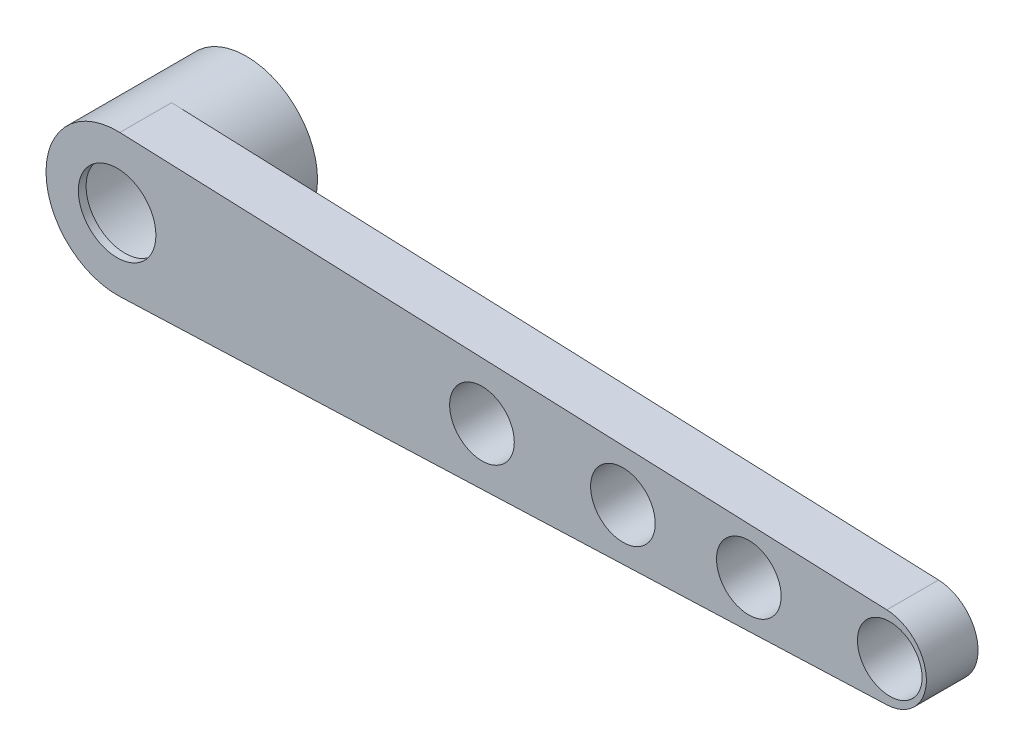
ISO-10303-21;
HEADER;
FILE_DESCRIPTION(('STEP AP214'),'2;1');
FILE_NAME('part.step','',(''),(''),'','','');
FILE_SCHEMA(('AUTOMOTIVE_DESIGN { 1 0 10303 214 1 1 1 1 }'));
ENDSEC;
DATA;
#1=APPLICATION_CONTEXT('core data for automotive mechanical design processes');
#2=APPLICATION_PROTOCOL_DEFINITION('international standard','automotive_design',2000,#1);
#3=PRODUCT_CONTEXT('',#1,'mechanical');
#4=PRODUCT('Part','Part','',(#3));
#5=PRODUCT_RELATED_PRODUCT_CATEGORY('part','',(#4));
#6=PRODUCT_DEFINITION_FORMATION('','',#4);
#7=PRODUCT_DEFINITION_CONTEXT('part definition',#1,'design');
#8=PRODUCT_DEFINITION('design','',#6,#7);
#9=PRODUCT_DEFINITION_SHAPE('','',#8);
#10=(LENGTH_UNIT() NAMED_UNIT(*) SI_UNIT(.MILLI.,.METRE.));
#11=(NAMED_UNIT(*) PLANE_ANGLE_UNIT() SI_UNIT($,.RADIAN.));
#12=(NAMED_UNIT(*) SI_UNIT($,.STERADIAN.) SOLID_ANGLE_UNIT());
#13=UNCERTAINTY_MEASURE_WITH_UNIT(LENGTH_MEASURE(1.E-05),#10,'distance_accuracy_value','');
#14=(GEOMETRIC_REPRESENTATION_CONTEXT(3) GLOBAL_UNCERTAINTY_ASSIGNED_CONTEXT((#13)) GLOBAL_UNIT_ASSIGNED_CONTEXT((#10,
#11,#12)) REPRESENTATION_CONTEXT('',''));
#15=CARTESIAN_POINT('',(0.,0.,0.));
#16=DIRECTION('',(0.,0.,1.));
#17=DIRECTION('',(1.,0.,0.));
#18=AXIS2_PLACEMENT_3D('',#15,#16,#17);
#19=CARTESIAN_POINT('',(0.,0.,5.));
#20=DIRECTION('',(0.,0.,-1.));
#21=DIRECTION('',(-1.,0.,0.));
#22=AXIS2_PLACEMENT_3D('',#19,#20,#21);
#23=CYLINDRICAL_SURFACE('',#22,2.75);
#24=CARTESIAN_POINT('',(0.,0.,0.));
#25=DIRECTION('',(0.,0.,1.));
#26=DIRECTION('',(1.,0.,0.));
#27=AXIS2_PLACEMENT_3D('',#24,#25,#26);
#28=CIRCLE('',#27,2.75);
#29=CARTESIAN_POINT('',(2.75,0.,0.));
#30=VERTEX_POINT('',#29);
#31=EDGE_CURVE('E44',#30,#30,#28,.T.);
#32=ORIENTED_EDGE('',*,*,#31,.T.);
#33=EDGE_LOOP('',(#32));
#34=FACE_BOUND('',#33,.T.);
#35=DIRECTION('',(0.,0.,1.));
#36=VECTOR('',#35,1.);
#37=CARTESIAN_POINT('',(0.107193479801559,-2.74791003453316,3.));
#38=LINE('',#37,#36);
#39=CARTESIAN_POINT('',(0.107193479801559,-2.74791003453316,3.));
#40=VERTEX_POINT('',#39);
#41=CARTESIAN_POINT('',(0.107193479801559,-2.74791003453316,5.));
#42=VERTEX_POINT('',#41);
#43=EDGE_CURVE('E98',#40,#42,#38,.T.);
#44=ORIENTED_EDGE('',*,*,#43,.T.);
#45=CARTESIAN_POINT('',(0.,0.,5.));
#46=DIRECTION('',(0.,0.,1.));
#47=DIRECTION('',(1.,0.,0.));
#48=AXIS2_PLACEMENT_3D('',#45,#46,#47);
#49=CIRCLE('',#48,2.75);
#50=CARTESIAN_POINT('',(0.107193479801559,2.74791003453316,5.));
#51=VERTEX_POINT('',#50);
#52=EDGE_CURVE('E11',#51,#42,#49,.T.);
#53=ORIENTED_EDGE('',*,*,#52,.F.);
#54=DIRECTION('',(0.,0.,1.));
#55=VECTOR('',#54,1.);
#56=CARTESIAN_POINT('',(0.107193479801559,2.74791003453316,3.));
#57=LINE('',#56,#55);
#58=CARTESIAN_POINT('',(0.107193479801559,2.74791003453316,3.));
#59=VERTEX_POINT('',#58);
#60=EDGE_CURVE('E93',#59,#51,#57,.T.);
#61=ORIENTED_EDGE('',*,*,#60,.F.);
#62=CARTESIAN_POINT('',(0.,0.,3.));
#63=DIRECTION('',(0.,0.,1.));
#64=DIRECTION('',(1.,0.,0.));
#65=AXIS2_PLACEMENT_3D('',#62,#63,#64);
#66=CIRCLE('',#65,2.75);
#67=EDGE_CURVE('E84',#40,#59,#66,.T.);
#68=ORIENTED_EDGE('',*,*,#67,.F.);
#69=EDGE_LOOP('',(#44,#53,#61,#68));
#70=FACE_BOUND('',#69,.T.);
#71=ADVANCED_FACE('F36',(#34,#70),#23,.T.);
#72=CARTESIAN_POINT('',(0.,0.,5.));
#73=DIRECTION('',(0.,0.,1.));
#74=DIRECTION('',(1.,0.,0.));
#75=AXIS2_PLACEMENT_3D('',#72,#73,#74);
#76=PLANE('',#75);
#77=CARTESIAN_POINT('',(19.56,0.,5.));
#78=DIRECTION('',(0.,0.,1.));
#79=DIRECTION('',(1.,0.,0.));
#80=AXIS2_PLACEMENT_3D('',#77,#78,#79);
#81=CIRCLE('',#80,1.25);
#82=CARTESIAN_POINT('',(20.81,0.,5.));
#83=VERTEX_POINT('',#82);
#84=EDGE_CURVE('E183',#83,#83,#81,.T.);
#85=ORIENTED_EDGE('',*,*,#84,.F.);
#86=EDGE_LOOP('',(#85));
#87=FACE_BOUND('',#86,.T.);
#88=CARTESIAN_POINT('',(0.,0.,5.));
#89=DIRECTION('',(0.,0.,1.));
#90=DIRECTION('',(1.,0.,0.));
#91=AXIS2_PLACEMENT_3D('',#88,#89,#90);
#92=CIRCLE('',#91,1.5);
#93=CARTESIAN_POINT('',(1.5,0.,5.));
#94=VERTEX_POINT('',#93);
#95=EDGE_CURVE('E104',#94,#94,#92,.T.);
#96=ORIENTED_EDGE('',*,*,#95,.F.);
#97=EDGE_LOOP('',(#96));
#98=FACE_BOUND('',#97,.T.);
#99=ORIENTED_EDGE('',*,*,#52,.T.);
#100=DIRECTION('',(0.999240012557513,0.038979447200567,0.));
#101=VECTOR('',#100,1.);
#102=CARTESIAN_POINT('',(0.107193479801559,-2.74791003453316,5.));
#103=LINE('',#102,#101);
#104=CARTESIAN_POINT('',(29.7651809847428,-1.59097882331688,5.));
#105=VERTEX_POINT('',#104);
#106=EDGE_CURVE('E196',#42,#105,#103,.T.);
#107=ORIENTED_EDGE('',*,*,#106,.T.);
#108=CARTESIAN_POINT('',(29.7031183428736,0.,5.));
#109=DIRECTION('',(0.,0.,1.));
#110=DIRECTION('',(1.,0.,0.));
#111=AXIS2_PLACEMENT_3D('',#108,#109,#110);
#112=CIRCLE('',#111,1.59218886686177);
#113=CARTESIAN_POINT('',(29.7651809847428,1.59097882331688,5.));
#114=VERTEX_POINT('',#113);
#115=EDGE_CURVE('E209',#114,#105,#112,.F.);
#116=ORIENTED_EDGE('',*,*,#115,.F.);
#117=DIRECTION('',(0.999240012557513,-0.038979447200567,0.));
#118=VECTOR('',#117,1.);
#119=CARTESIAN_POINT('',(0.107193479801559,2.74791003453316,5.));
#120=LINE('',#119,#118);
#121=EDGE_CURVE('E51',#51,#114,#120,.T.);
#122=ORIENTED_EDGE('',*,*,#121,.F.);
#123=EDGE_LOOP('',(#99,#107,#116,#122));
#124=FACE_BOUND('',#123,.T.);
#125=CARTESIAN_POINT('',(29.8799998001637,0.00345575100310028,5.));
#126=DIRECTION('',(0.,0.,1.));
#127=DIRECTION('',(1.,0.,0.));
#128=AXIS2_PLACEMENT_3D('',#125,#126,#127);
#129=CIRCLE('',#128,1.25);
#130=CARTESIAN_POINT('',(31.1299998001637,0.00345575100310028,5.));
#131=VERTEX_POINT('',#130);
#132=EDGE_CURVE('E186',#131,#131,#129,.T.);
#133=ORIENTED_EDGE('',*,*,#132,.F.);
#134=EDGE_LOOP('',(#133));
#135=FACE_BOUND('',#134,.T.);
#136=CARTESIAN_POINT('',(24.43,0.,5.));
#137=DIRECTION('',(0.,0.,1.));
#138=DIRECTION('',(1.,0.,0.));
#139=AXIS2_PLACEMENT_3D('',#136,#137,#138);
#140=CIRCLE('',#139,1.25);
#141=CARTESIAN_POINT('',(25.68,0.,5.));
#142=VERTEX_POINT('',#141);
#143=EDGE_CURVE('E188',#142,#142,#140,.T.);
#144=ORIENTED_EDGE('',*,*,#143,.F.);
#145=EDGE_LOOP('',(#144));
#146=FACE_BOUND('',#145,.T.);
#147=CARTESIAN_POINT('',(14.11,0.,5.));
#148=DIRECTION('',(0.,0.,1.));
#149=DIRECTION('',(1.,0.,0.));
#150=AXIS2_PLACEMENT_3D('',#147,#148,#149);
#151=CIRCLE('',#150,1.25);
#152=CARTESIAN_POINT('',(15.36,0.,5.));
#153=VERTEX_POINT('',#152);
#154=EDGE_CURVE('E206',#153,#153,#151,.T.);
#155=ORIENTED_EDGE('',*,*,#154,.F.);
#156=EDGE_LOOP('',(#155));
#157=FACE_BOUND('',#156,.T.);
#158=ADVANCED_FACE('F136',(#87,#98,#124,#135,#146,#157),#76,.T.);
#159=CARTESIAN_POINT('',(0.,0.,0.));
#160=DIRECTION('',(0.,0.,1.));
#161=DIRECTION('',(1.,0.,0.));
#162=AXIS2_PLACEMENT_3D('',#159,#160,#161);
#163=PLANE('',#162);
#164=CARTESIAN_POINT('',(0.,0.,0.));
#165=DIRECTION('',(0.,0.,-1.));
#166=DIRECTION('',(-1.,0.,0.));
#167=AXIS2_PLACEMENT_3D('',#164,#165,#166);
#168=CIRCLE('',#167,2.5);
#169=CARTESIAN_POINT('',(-2.5,0.,0.));
#170=VERTEX_POINT('',#169);
#171=EDGE_CURVE('E111',#170,#170,#168,.T.);
#172=ORIENTED_EDGE('',*,*,#171,.F.);
#173=EDGE_LOOP('',(#172));
#174=FACE_BOUND('',#173,.T.);
#175=ORIENTED_EDGE('',*,*,#31,.F.);
#176=EDGE_LOOP('',(#175));
#177=FACE_BOUND('',#176,.T.);
#178=ADVANCED_FACE('F130',(#174,#177),#163,.F.);
#179=CARTESIAN_POINT('',(0.,0.,4.7));
#180=DIRECTION('',(0.,0.,-1.));
#181=DIRECTION('',(-1.,0.,0.));
#182=AXIS2_PLACEMENT_3D('',#179,#180,#181);
#183=CYLINDRICAL_SURFACE('',#182,2.5);
#184=CARTESIAN_POINT('',(0.,0.,4.7));
#185=DIRECTION('',(0.,0.,-1.));
#186=DIRECTION('',(-1.,0.,0.));
#187=AXIS2_PLACEMENT_3D('',#184,#185,#186);
#188=CIRCLE('',#187,2.5);
#189=CARTESIAN_POINT('',(-2.5,0.,4.7));
#190=VERTEX_POINT('',#189);
#191=EDGE_CURVE('E108',#190,#190,#188,.T.);
#192=ORIENTED_EDGE('',*,*,#191,.F.);
#193=EDGE_LOOP('',(#192));
#194=FACE_BOUND('',#193,.T.);
#195=ORIENTED_EDGE('',*,*,#171,.T.);
#196=EDGE_LOOP('',(#195));
#197=FACE_BOUND('',#196,.T.);
#198=ADVANCED_FACE('F124',(#194,#197),#183,.F.);
#199=CARTESIAN_POINT('',(0.,0.,4.7));
#200=DIRECTION('',(0.,0.,-1.));
#201=DIRECTION('',(-1.,0.,0.));
#202=AXIS2_PLACEMENT_3D('',#199,#200,#201);
#203=PLANE('',#202);
#204=CARTESIAN_POINT('',(0.,0.,4.7));
#205=DIRECTION('',(0.,0.,-1.));
#206=DIRECTION('',(-1.,0.,0.));
#207=AXIS2_PLACEMENT_3D('',#204,#205,#206);
#208=CIRCLE('',#207,1.5);
#209=CARTESIAN_POINT('',(-1.5,0.,4.7));
#210=VERTEX_POINT('',#209);
#211=EDGE_CURVE('E107',#210,#210,#208,.T.);
#212=ORIENTED_EDGE('',*,*,#211,.F.);
#213=EDGE_LOOP('',(#212));
#214=FACE_BOUND('',#213,.T.);
#215=ORIENTED_EDGE('',*,*,#191,.T.);
#216=EDGE_LOOP('',(#215));
#217=FACE_BOUND('',#216,.T.);
#218=ADVANCED_FACE('F121',(#214,#217),#203,.T.);
#219=CARTESIAN_POINT('',(0.,0.,0.3));
#220=DIRECTION('',(0.,0.,1.));
#221=DIRECTION('',(1.,0.,0.));
#222=AXIS2_PLACEMENT_3D('',#219,#220,#221);
#223=CYLINDRICAL_SURFACE('',#222,1.5);
#224=ORIENTED_EDGE('',*,*,#211,.T.);
#225=EDGE_LOOP('',(#224));
#226=FACE_BOUND('',#225,.T.);
#227=ORIENTED_EDGE('',*,*,#95,.T.);
#228=EDGE_LOOP('',(#227));
#229=FACE_BOUND('',#228,.T.);
#230=ADVANCED_FACE('F118',(#226,#229),#223,.F.);
#231=CARTESIAN_POINT('',(29.7031183428736,0.,3.));
#232=DIRECTION('',(0.,0.,1.));
#233=DIRECTION('',(1.,0.,0.));
#234=AXIS2_PLACEMENT_3D('',#231,#232,#233);
#235=CYLINDRICAL_SURFACE('',#234,1.59218886686177);
#236=ORIENTED_EDGE('',*,*,#115,.T.);
#237=DIRECTION('',(0.,0.,1.));
#238=VECTOR('',#237,1.);
#239=CARTESIAN_POINT('',(29.7651809847428,-1.59097882331688,3.));
#240=LINE('',#239,#238);
#241=CARTESIAN_POINT('',(29.7651809847428,-1.59097882331688,3.));
#242=VERTEX_POINT('',#241);
#243=EDGE_CURVE('E76',#242,#105,#240,.T.);
#244=ORIENTED_EDGE('',*,*,#243,.F.);
#245=CARTESIAN_POINT('',(29.7031183428736,0.,3.));
#246=DIRECTION('',(0.,0.,1.));
#247=DIRECTION('',(1.,0.,0.));
#248=AXIS2_PLACEMENT_3D('',#245,#246,#247);
#249=CIRCLE('',#248,1.59218886686177);
#250=CARTESIAN_POINT('',(29.7651809847428,1.59097882331688,3.));
#251=VERTEX_POINT('',#250);
#252=EDGE_CURVE('E60',#251,#242,#249,.F.);
#253=ORIENTED_EDGE('',*,*,#252,.F.);
#254=DIRECTION('',(0.,0.,1.));
#255=VECTOR('',#254,1.);
#256=CARTESIAN_POINT('',(29.7651809847428,1.59097882331688,3.));
#257=LINE('',#256,#255);
#258=EDGE_CURVE('E96',#251,#114,#257,.T.);
#259=ORIENTED_EDGE('',*,*,#258,.T.);
#260=EDGE_LOOP('',(#236,#244,#253,#259));
#261=FACE_BOUND('',#260,.T.);
#262=ADVANCED_FACE('F152',(#261),#235,.T.);
#263=CARTESIAN_POINT('',(0.107193479801559,-2.74791003453316,3.));
#264=DIRECTION('',(0.038979447200567,-0.999240012557513,0.));
#265=DIRECTION('',(0.999240012557513,0.038979447200567,0.));
#266=AXIS2_PLACEMENT_3D('',#263,#264,#265);
#267=PLANE('',#266);
#268=ORIENTED_EDGE('',*,*,#106,.F.);
#269=ORIENTED_EDGE('',*,*,#43,.F.);
#270=DIRECTION('',(0.999240012557513,0.038979447200567,0.));
#271=VECTOR('',#270,1.);
#272=CARTESIAN_POINT('',(0.107193479801559,-2.74791003453316,3.));
#273=LINE('',#272,#271);
#274=EDGE_CURVE('E86',#40,#242,#273,.T.);
#275=ORIENTED_EDGE('',*,*,#274,.T.);
#276=ORIENTED_EDGE('',*,*,#243,.T.);
#277=EDGE_LOOP('',(#268,#269,#275,#276));
#278=FACE_BOUND('',#277,.T.);
#279=ADVANCED_FACE('F164',(#278),#267,.T.);
#280=CARTESIAN_POINT('',(14.11,0.,3.));
#281=DIRECTION('',(0.,0.,1.));
#282=DIRECTION('',(1.,0.,0.));
#283=AXIS2_PLACEMENT_3D('',#280,#281,#282);
#284=CYLINDRICAL_SURFACE('',#283,1.25);
#285=CARTESIAN_POINT('',(14.11,0.,3.));
#286=DIRECTION('',(0.,0.,1.));
#287=DIRECTION('',(1.,0.,0.));
#288=AXIS2_PLACEMENT_3D('',#285,#286,#287);
#289=CIRCLE('',#288,1.25);
#290=CARTESIAN_POINT('',(15.36,0.,3.));
#291=VERTEX_POINT('',#290);
#292=EDGE_CURVE('E199',#291,#291,#289,.T.);
#293=ORIENTED_EDGE('',*,*,#292,.F.);
#294=EDGE_LOOP('',(#293));
#295=FACE_BOUND('',#294,.T.);
#296=ORIENTED_EDGE('',*,*,#154,.T.);
#297=EDGE_LOOP('',(#296));
#298=FACE_BOUND('',#297,.T.);
#299=ADVANCED_FACE('F160',(#295,#298),#284,.F.);
#300=CARTESIAN_POINT('',(24.43,0.,3.));
#301=DIRECTION('',(0.,0.,1.));
#302=DIRECTION('',(1.,0.,0.));
#303=AXIS2_PLACEMENT_3D('',#300,#301,#302);
#304=CYLINDRICAL_SURFACE('',#303,1.25);
#305=CARTESIAN_POINT('',(24.43,0.,3.));
#306=DIRECTION('',(0.,0.,1.));
#307=DIRECTION('',(1.,0.,0.));
#308=AXIS2_PLACEMENT_3D('',#305,#306,#307);
#309=CIRCLE('',#308,1.25);
#310=CARTESIAN_POINT('',(25.68,0.,3.));
#311=VERTEX_POINT('',#310);
#312=EDGE_CURVE('E195',#311,#311,#309,.T.);
#313=ORIENTED_EDGE('',*,*,#312,.F.);
#314=EDGE_LOOP('',(#313));
#315=FACE_BOUND('',#314,.T.);
#316=ORIENTED_EDGE('',*,*,#143,.T.);
#317=EDGE_LOOP('',(#316));
#318=FACE_BOUND('',#317,.T.);
#319=ADVANCED_FACE('F156',(#315,#318),#304,.F.);
#320=CARTESIAN_POINT('',(29.8799998001637,0.00345575100310028,3.));
#321=DIRECTION('',(0.,0.,1.));
#322=DIRECTION('',(1.,0.,0.));
#323=AXIS2_PLACEMENT_3D('',#320,#321,#322);
#324=CYLINDRICAL_SURFACE('',#323,1.25);
#325=CARTESIAN_POINT('',(29.8799998001637,0.00345575100310028,3.));
#326=DIRECTION('',(0.,0.,1.));
#327=DIRECTION('',(1.,0.,0.));
#328=AXIS2_PLACEMENT_3D('',#325,#326,#327);
#329=CIRCLE('',#328,1.25);
#330=CARTESIAN_POINT('',(31.1299998001637,0.00345575100310028,3.));
#331=VERTEX_POINT('',#330);
#332=EDGE_CURVE('E192',#331,#331,#329,.T.);
#333=ORIENTED_EDGE('',*,*,#332,.F.);
#334=EDGE_LOOP('',(#333));
#335=FACE_BOUND('',#334,.T.);
#336=ORIENTED_EDGE('',*,*,#132,.T.);
#337=EDGE_LOOP('',(#336));
#338=FACE_BOUND('',#337,.T.);
#339=ADVANCED_FACE('F153',(#335,#338),#324,.F.);
#340=CARTESIAN_POINT('',(0.107193479801559,2.74791003453316,3.));
#341=DIRECTION('',(-0.038979447200567,-0.999240012557513,0.));
#342=DIRECTION('',(0.999240012557513,-0.038979447200567,0.));
#343=AXIS2_PLACEMENT_3D('',#340,#341,#342);
#344=PLANE('',#343);
#345=ORIENTED_EDGE('',*,*,#121,.T.);
#346=ORIENTED_EDGE('',*,*,#258,.F.);
#347=DIRECTION('',(0.999240012557513,-0.038979447200567,0.));
#348=VECTOR('',#347,1.);
#349=CARTESIAN_POINT('',(0.107193479801559,2.74791003453316,3.));
#350=LINE('',#349,#348);
#351=EDGE_CURVE('E81',#59,#251,#350,.T.);
#352=ORIENTED_EDGE('',*,*,#351,.F.);
#353=ORIENTED_EDGE('',*,*,#60,.T.);
#354=EDGE_LOOP('',(#345,#346,#352,#353));
#355=FACE_BOUND('',#354,.T.);
#356=ADVANCED_FACE('F92',(#355),#344,.F.);
#357=CARTESIAN_POINT('',(0.,0.,3.));
#358=DIRECTION('',(0.,0.,1.));
#359=DIRECTION('',(1.,0.,0.));
#360=AXIS2_PLACEMENT_3D('',#357,#358,#359);
#361=PLANE('',#360);
#362=CARTESIAN_POINT('',(19.56,0.,3.));
#363=DIRECTION('',(0.,0.,1.));
#364=DIRECTION('',(1.,0.,0.));
#365=AXIS2_PLACEMENT_3D('',#362,#363,#364);
#366=CIRCLE('',#365,1.25);
#367=CARTESIAN_POINT('',(20.81,0.,3.));
#368=VERTEX_POINT('',#367);
#369=EDGE_CURVE('E39',#368,#368,#366,.T.);
#370=ORIENTED_EDGE('',*,*,#369,.T.);
#371=EDGE_LOOP('',(#370));
#372=FACE_BOUND('',#371,.T.);
#373=ORIENTED_EDGE('',*,*,#332,.T.);
#374=EDGE_LOOP('',(#373));
#375=FACE_BOUND('',#374,.T.);
#376=ORIENTED_EDGE('',*,*,#312,.T.);
#377=EDGE_LOOP('',(#376));
#378=FACE_BOUND('',#377,.T.);
#379=ORIENTED_EDGE('',*,*,#292,.T.);
#380=EDGE_LOOP('',(#379));
#381=FACE_BOUND('',#380,.T.);
#382=ORIENTED_EDGE('',*,*,#252,.T.);
#383=ORIENTED_EDGE('',*,*,#274,.F.);
#384=ORIENTED_EDGE('',*,*,#67,.T.);
#385=ORIENTED_EDGE('',*,*,#351,.T.);
#386=EDGE_LOOP('',(#382,#383,#384,#385));
#387=FACE_BOUND('',#386,.T.);
#388=ADVANCED_FACE('F85',(#372,#375,#378,#381,#387),#361,.F.);
#389=CARTESIAN_POINT('',(19.56,0.,-5.));
#390=DIRECTION('',(0.,0.,1.));
#391=DIRECTION('',(1.,0.,0.));
#392=AXIS2_PLACEMENT_3D('',#389,#390,#391);
#393=CYLINDRICAL_SURFACE('',#392,1.25);
#394=ORIENTED_EDGE('',*,*,#84,.T.);
#395=EDGE_LOOP('',(#394));
#396=FACE_BOUND('',#395,.T.);
#397=ORIENTED_EDGE('',*,*,#369,.F.);
#398=EDGE_LOOP('',(#397));
#399=FACE_BOUND('',#398,.T.);
#400=ADVANCED_FACE('F175',(#396,#399),#393,.F.);
#401=CLOSED_SHELL('',(#71,#158,#178,#198,#218,#230,#262,#279,#299,#319,#339,#356,#388,#400));
#402=MANIFOLD_SOLID_BREP('B2',#401);
#403=ADVANCED_BREP_SHAPE_REPRESENTATION('',(#18,#402),#14);
#404=SHAPE_DEFINITION_REPRESENTATION(#9,#403);
ENDSEC;
END-ISO-10303-21;
